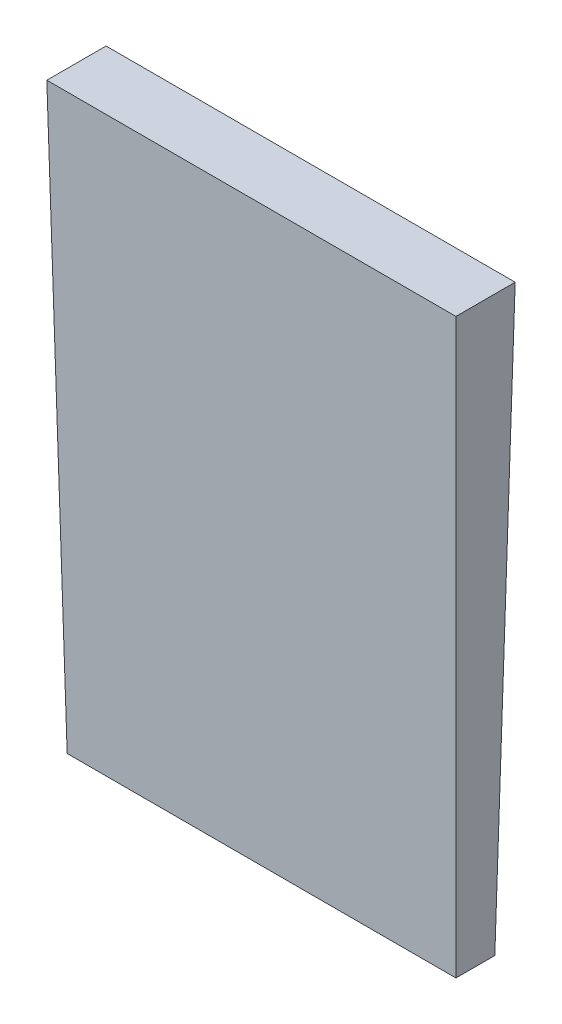
ISO-10303-21;
HEADER;
FILE_DESCRIPTION(('STEP AP214'),'2;1');
FILE_NAME('part.step','',(''),(''),'','','');
FILE_SCHEMA(('AUTOMOTIVE_DESIGN { 1 0 10303 214 1 1 1 1 }'));
ENDSEC;
DATA;
#1=APPLICATION_CONTEXT('core data for automotive mechanical design processes');
#2=APPLICATION_PROTOCOL_DEFINITION('international standard','automotive_design',2000,#1);
#3=PRODUCT_CONTEXT('',#1,'mechanical');
#4=PRODUCT('Part','Part','',(#3));
#5=PRODUCT_RELATED_PRODUCT_CATEGORY('part','',(#4));
#6=PRODUCT_DEFINITION_FORMATION('','',#4);
#7=PRODUCT_DEFINITION_CONTEXT('part definition',#1,'design');
#8=PRODUCT_DEFINITION('design','',#6,#7);
#9=PRODUCT_DEFINITION_SHAPE('','',#8);
#10=(LENGTH_UNIT() NAMED_UNIT(*) SI_UNIT(.MILLI.,.METRE.));
#11=(NAMED_UNIT(*) PLANE_ANGLE_UNIT() SI_UNIT($,.RADIAN.));
#12=(NAMED_UNIT(*) SI_UNIT($,.STERADIAN.) SOLID_ANGLE_UNIT());
#13=UNCERTAINTY_MEASURE_WITH_UNIT(LENGTH_MEASURE(1.E-05),#10,'distance_accuracy_value','');
#14=(GEOMETRIC_REPRESENTATION_CONTEXT(3) GLOBAL_UNCERTAINTY_ASSIGNED_CONTEXT((#13)) GLOBAL_UNIT_ASSIGNED_CONTEXT((#10,
#11,#12)) REPRESENTATION_CONTEXT('',''));
#15=CARTESIAN_POINT('',(0.,0.,0.));
#16=DIRECTION('',(0.,0.,1.));
#17=DIRECTION('',(1.,0.,0.));
#18=AXIS2_PLACEMENT_3D('',#15,#16,#17);
#19=CARTESIAN_POINT('',(0.5,-0.750000000000004,0.1));
#20=DIRECTION('',(0.999847695156391,-0.0174524064372835,0.));
#21=DIRECTION('',(0.0174524064372835,0.999847695156391,0.));
#22=AXIS2_PLACEMENT_3D('',#19,#20,#21);
#23=PLANE('',#22);
#24=DIRECTION('',(-0.0174497491606827,-0.999695459881887,0.0174497491606827));
#25=VECTOR('',#24,1.);
#26=CARTESIAN_POINT('',(0.49969550625423,-0.767444435012016,0.000304493745770748));
#27=LINE('',#26,#25);
#28=CARTESIAN_POINT('',(0.5,-0.750000000000004,0.));
#29=VERTEX_POINT('',#28);
#30=CARTESIAN_POINT('',(0.526182597392327,0.749999999999997,-0.0261825973923265));
#31=VERTEX_POINT('',#30);
#32=EDGE_CURVE('E82',#29,#31,#27,.F.);
#33=ORIENTED_EDGE('',*,*,#32,.T.);
#34=DIRECTION('',(0.,0.,1.));
#35=VECTOR('',#34,1.);
#36=CARTESIAN_POINT('',(0.526182597392327,0.749999999999997,0.1));
#37=LINE('',#36,#35);
#38=CARTESIAN_POINT('',(0.526182597392327,0.749999999999997,0.126182597392326));
#39=VERTEX_POINT('',#38);
#40=EDGE_CURVE('E11',#39,#31,#37,.F.);
#41=ORIENTED_EDGE('',*,*,#40,.F.);
#42=DIRECTION('',(0.0174497491606827,0.999695459881887,0.0174497491606827));
#43=VECTOR('',#42,1.);
#44=CARTESIAN_POINT('',(0.49969550625423,-0.767444435012016,0.0996955062542293));
#45=LINE('',#44,#43);
#46=CARTESIAN_POINT('',(0.5,-0.750000000000004,0.1));
#47=VERTEX_POINT('',#46);
#48=EDGE_CURVE('E74',#47,#39,#45,.T.);
#49=ORIENTED_EDGE('',*,*,#48,.F.);
#50=DIRECTION('',(0.,0.,-1.));
#51=VECTOR('',#50,1.);
#52=CARTESIAN_POINT('',(0.5,-0.750000000000004,0.1));
#53=LINE('',#52,#51);
#54=EDGE_CURVE('E83',#47,#29,#53,.T.);
#55=ORIENTED_EDGE('',*,*,#54,.T.);
#56=EDGE_LOOP('',(#33,#41,#49,#55));
#57=FACE_BOUND('',#56,.T.);
#58=ADVANCED_FACE('F32',(#57),#23,.T.);
#59=CARTESIAN_POINT('',(-0.5,0.749999999999997,0.1));
#60=DIRECTION('',(0.,-1.,0.));
#61=DIRECTION('',(0.,0.,-1.));
#62=AXIS2_PLACEMENT_3D('',#59,#60,#61);
#63=PLANE('',#62);
#64=DIRECTION('',(-1.,0.,0.));
#65=VECTOR('',#64,1.);
#66=CARTESIAN_POINT('',(-0.5,0.749999999999997,-0.0261825973923265));
#67=LINE('',#66,#65);
#68=CARTESIAN_POINT('',(-0.526182597392327,0.749999999999997,-0.0261825973923265));
#69=VERTEX_POINT('',#68);
#70=EDGE_CURVE('E87',#31,#69,#67,.T.);
#71=ORIENTED_EDGE('',*,*,#70,.T.);
#72=DIRECTION('',(0.,0.,1.));
#73=VECTOR('',#72,1.);
#74=CARTESIAN_POINT('',(-0.526182597392327,0.749999999999997,0.1));
#75=LINE('',#74,#73);
#76=CARTESIAN_POINT('',(-0.526182597392327,0.749999999999997,0.126182597392326));
#77=VERTEX_POINT('',#76);
#78=EDGE_CURVE('E40',#77,#69,#75,.F.);
#79=ORIENTED_EDGE('',*,*,#78,.F.);
#80=DIRECTION('',(1.,0.,0.));
#81=VECTOR('',#80,1.);
#82=CARTESIAN_POINT('',(-0.5,0.749999999999997,0.126182597392326));
#83=LINE('',#82,#81);
#84=EDGE_CURVE('E67',#39,#77,#83,.F.);
#85=ORIENTED_EDGE('',*,*,#84,.F.);
#86=ORIENTED_EDGE('',*,*,#40,.T.);
#87=EDGE_LOOP('',(#71,#79,#85,#86));
#88=FACE_BOUND('',#87,.T.);
#89=ADVANCED_FACE('F68',(#88),#63,.F.);
#90=CARTESIAN_POINT('',(-0.5,-0.750000000000004,0.1));
#91=DIRECTION('',(-0.999847695156391,-0.0174524064372835,0.));
#92=DIRECTION('',(0.0174524064372835,-0.999847695156391,0.));
#93=AXIS2_PLACEMENT_3D('',#90,#91,#92);
#94=PLANE('',#93);
#95=DIRECTION('',(-0.0174497491606827,0.999695459881887,-0.0174497491606827));
#96=VECTOR('',#95,1.);
#97=CARTESIAN_POINT('',(-0.5,-0.750000000000004,0.));
#98=LINE('',#97,#96);
#99=CARTESIAN_POINT('',(-0.5,-0.750000000000004,0.));
#100=VERTEX_POINT('',#99);
#101=EDGE_CURVE('E89',#69,#100,#98,.F.);
#102=ORIENTED_EDGE('',*,*,#101,.T.);
#103=DIRECTION('',(0.,0.,-1.));
#104=VECTOR('',#103,1.);
#105=CARTESIAN_POINT('',(-0.5,-0.750000000000004,0.1));
#106=LINE('',#105,#104);
#107=CARTESIAN_POINT('',(-0.5,-0.750000000000004,0.1));
#108=VERTEX_POINT('',#107);
#109=EDGE_CURVE('E94',#108,#100,#106,.T.);
#110=ORIENTED_EDGE('',*,*,#109,.F.);
#111=DIRECTION('',(0.0174497491606827,-0.999695459881887,-0.0174497491606827));
#112=VECTOR('',#111,1.);
#113=CARTESIAN_POINT('',(-0.5,-0.750000000000004,0.1));
#114=LINE('',#113,#112);
#115=EDGE_CURVE('E73',#77,#108,#114,.T.);
#116=ORIENTED_EDGE('',*,*,#115,.F.);
#117=ORIENTED_EDGE('',*,*,#78,.T.);
#118=EDGE_LOOP('',(#102,#110,#116,#117));
#119=FACE_BOUND('',#118,.T.);
#120=ADVANCED_FACE('F106',(#119),#94,.T.);
#121=CARTESIAN_POINT('',(-0.5,-0.750000000000004,0.1));
#122=DIRECTION('',(0.,1.,0.));
#123=DIRECTION('',(0.,0.,1.));
#124=AXIS2_PLACEMENT_3D('',#121,#122,#123);
#125=PLANE('',#124);
#126=DIRECTION('',(1.,0.,0.));
#127=VECTOR('',#126,1.);
#128=CARTESIAN_POINT('',(-0.5,-0.750000000000004,0.));
#129=LINE('',#128,#127);
#130=EDGE_CURVE('E80',#100,#29,#129,.T.);
#131=ORIENTED_EDGE('',*,*,#130,.T.);
#132=ORIENTED_EDGE('',*,*,#54,.F.);
#133=DIRECTION('',(1.,0.,0.));
#134=VECTOR('',#133,1.);
#135=CARTESIAN_POINT('',(-0.5,-0.750000000000004,0.1));
#136=LINE('',#135,#134);
#137=EDGE_CURVE('E48',#108,#47,#136,.T.);
#138=ORIENTED_EDGE('',*,*,#137,.F.);
#139=ORIENTED_EDGE('',*,*,#109,.T.);
#140=EDGE_LOOP('',(#131,#132,#138,#139));
#141=FACE_BOUND('',#140,.T.);
#142=ADVANCED_FACE('F101',(#141),#125,.F.);
#143=CARTESIAN_POINT('',(-0.5,-0.750000000000004,0.1));
#144=DIRECTION('',(0.,-0.0174524064372835,0.999847695156391));
#145=DIRECTION('',(0.,-0.999847695156391,-0.0174524064372835));
#146=AXIS2_PLACEMENT_3D('',#143,#144,#145);
#147=PLANE('',#146);
#148=ORIENTED_EDGE('',*,*,#48,.T.);
#149=ORIENTED_EDGE('',*,*,#84,.T.);
#150=ORIENTED_EDGE('',*,*,#115,.T.);
#151=ORIENTED_EDGE('',*,*,#137,.T.);
#152=EDGE_LOOP('',(#148,#149,#150,#151));
#153=FACE_BOUND('',#152,.T.);
#154=ADVANCED_FACE('F77',(#153),#147,.T.);
#155=CARTESIAN_POINT('',(-0.5,-0.750000000000004,0.));
#156=DIRECTION('',(0.,-0.0174524064372835,-0.999847695156391));
#157=DIRECTION('',(0.,0.999847695156391,-0.0174524064372835));
#158=AXIS2_PLACEMENT_3D('',#155,#156,#157);
#159=PLANE('',#158);
#160=ORIENTED_EDGE('',*,*,#32,.F.);
#161=ORIENTED_EDGE('',*,*,#130,.F.);
#162=ORIENTED_EDGE('',*,*,#101,.F.);
#163=ORIENTED_EDGE('',*,*,#70,.F.);
#164=EDGE_LOOP('',(#160,#161,#162,#163));
#165=FACE_BOUND('',#164,.T.);
#166=ADVANCED_FACE('F104',(#165),#159,.T.);
#167=CLOSED_SHELL('',(#58,#89,#120,#142,#154,#166));
#168=MANIFOLD_SOLID_BREP('B2',#167);
#169=ADVANCED_BREP_SHAPE_REPRESENTATION('',(#18,#168),#14);
#170=SHAPE_DEFINITION_REPRESENTATION(#9,#169);
ENDSEC;
END-ISO-10303-21;
